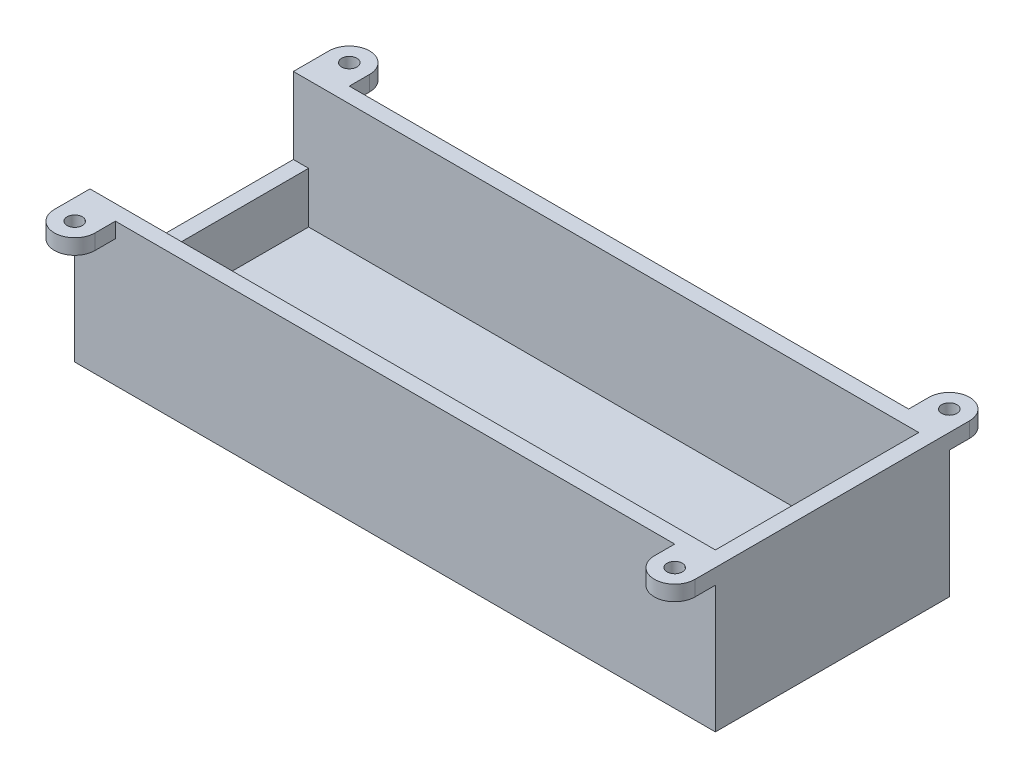
ISO-10303-21;
HEADER;
FILE_DESCRIPTION(('STEP AP214'),'2;1');
FILE_NAME('part.step','',(''),(''),'','','');
FILE_SCHEMA(('AUTOMOTIVE_DESIGN { 1 0 10303 214 1 1 1 1 }'));
ENDSEC;
DATA;
#1=APPLICATION_CONTEXT('core data for automotive mechanical design processes');
#2=APPLICATION_PROTOCOL_DEFINITION('international standard','automotive_design',2000,#1);
#3=PRODUCT_CONTEXT('',#1,'mechanical');
#4=PRODUCT('Part','Part','',(#3));
#5=PRODUCT_RELATED_PRODUCT_CATEGORY('part','',(#4));
#6=PRODUCT_DEFINITION_FORMATION('','',#4);
#7=PRODUCT_DEFINITION_CONTEXT('part definition',#1,'design');
#8=PRODUCT_DEFINITION('design','',#6,#7);
#9=PRODUCT_DEFINITION_SHAPE('','',#8);
#10=(LENGTH_UNIT() NAMED_UNIT(*) SI_UNIT(.MILLI.,.METRE.));
#11=(NAMED_UNIT(*) PLANE_ANGLE_UNIT() SI_UNIT($,.RADIAN.));
#12=(NAMED_UNIT(*) SI_UNIT($,.STERADIAN.) SOLID_ANGLE_UNIT());
#13=UNCERTAINTY_MEASURE_WITH_UNIT(LENGTH_MEASURE(1.E-05),#10,'distance_accuracy_value','');
#14=(GEOMETRIC_REPRESENTATION_CONTEXT(3) GLOBAL_UNCERTAINTY_ASSIGNED_CONTEXT((#13)) GLOBAL_UNIT_ASSIGNED_CONTEXT((#10,
#11,#12)) REPRESENTATION_CONTEXT('',''));
#15=CARTESIAN_POINT('',(0.,0.,0.));
#16=DIRECTION('',(0.,0.,1.));
#17=DIRECTION('',(1.,0.,0.));
#18=AXIS2_PLACEMENT_3D('',#15,#16,#17);
#19=CARTESIAN_POINT('',(-63.,3.,23.));
#20=DIRECTION('',(0.,0.,-1.));
#21=DIRECTION('',(-1.,0.,0.));
#22=AXIS2_PLACEMENT_3D('',#19,#20,#21);
#23=PLANE('',#22);
#24=DIRECTION('',(-1.,0.,0.));
#25=VECTOR('',#24,1.);
#26=CARTESIAN_POINT('',(55.,25.,23.));
#27=LINE('',#26,#25);
#28=CARTESIAN_POINT('',(63.,25.,23.));
#29=VERTEX_POINT('',#28);
#30=CARTESIAN_POINT('',(55.,25.,23.));
#31=VERTEX_POINT('',#30);
#32=EDGE_CURVE('E370',#29,#31,#27,.T.);
#33=ORIENTED_EDGE('',*,*,#32,.T.);
#34=DIRECTION('',(0.,1.,0.));
#35=VECTOR('',#34,1.);
#36=CARTESIAN_POINT('',(55.,25.,23.));
#37=LINE('',#36,#35);
#38=CARTESIAN_POINT('',(55.,28.,23.));
#39=VERTEX_POINT('',#38);
#40=EDGE_CURVE('E382',#31,#39,#37,.T.);
#41=ORIENTED_EDGE('',*,*,#40,.T.);
#42=DIRECTION('',(1.,0.,0.));
#43=VECTOR('',#42,1.);
#44=CARTESIAN_POINT('',(-63.,28.,23.));
#45=LINE('',#44,#43);
#46=CARTESIAN_POINT('',(-55.,28.,23.));
#47=VERTEX_POINT('',#46);
#48=EDGE_CURVE('E300',#47,#39,#45,.T.);
#49=ORIENTED_EDGE('',*,*,#48,.F.);
#50=DIRECTION('',(0.,1.,0.));
#51=VECTOR('',#50,1.);
#52=CARTESIAN_POINT('',(-55.,25.,23.));
#53=LINE('',#52,#51);
#54=CARTESIAN_POINT('',(-55.,25.,23.));
#55=VERTEX_POINT('',#54);
#56=EDGE_CURVE('E263',#55,#47,#53,.T.);
#57=ORIENTED_EDGE('',*,*,#56,.F.);
#58=DIRECTION('',(-1.,0.,0.));
#59=VECTOR('',#58,1.);
#60=CARTESIAN_POINT('',(-63.,25.,23.));
#61=LINE('',#60,#59);
#62=CARTESIAN_POINT('',(-63.,25.,23.));
#63=VERTEX_POINT('',#62);
#64=EDGE_CURVE('E253',#55,#63,#61,.T.);
#65=ORIENTED_EDGE('',*,*,#64,.T.);
#66=DIRECTION('',(0.,-1.,0.));
#67=VECTOR('',#66,1.);
#68=CARTESIAN_POINT('',(-63.,3.,23.));
#69=LINE('',#68,#67);
#70=CARTESIAN_POINT('',(-63.,0.,23.));
#71=VERTEX_POINT('',#70);
#72=EDGE_CURVE('E231',#63,#71,#69,.T.);
#73=ORIENTED_EDGE('',*,*,#72,.T.);
#74=DIRECTION('',(1.,0.,0.));
#75=VECTOR('',#74,1.);
#76=CARTESIAN_POINT('',(-63.,0.,23.));
#77=LINE('',#76,#75);
#78=CARTESIAN_POINT('',(63.,0.,23.));
#79=VERTEX_POINT('',#78);
#80=EDGE_CURVE('E226',#71,#79,#77,.T.);
#81=ORIENTED_EDGE('',*,*,#80,.T.);
#82=DIRECTION('',(0.,-1.,0.));
#83=VECTOR('',#82,1.);
#84=CARTESIAN_POINT('',(63.,3.,23.));
#85=LINE('',#84,#83);
#86=EDGE_CURVE('E229',#29,#79,#85,.T.);
#87=ORIENTED_EDGE('',*,*,#86,.F.);
#88=EDGE_LOOP('',(#33,#41,#49,#57,#65,#73,#81,#87));
#89=FACE_BOUND('',#88,.T.);
#90=ADVANCED_FACE('F35',(#89),#23,.F.);
#91=CARTESIAN_POINT('',(63.,3.,-23.));
#92=DIRECTION('',(-1.,0.,0.));
#93=DIRECTION('',(0.,0.,1.));
#94=AXIS2_PLACEMENT_3D('',#91,#92,#93);
#95=PLANE('',#94);
#96=DIRECTION('',(0.,0.,-1.));
#97=VECTOR('',#96,1.);
#98=CARTESIAN_POINT('',(63.,0.,-23.));
#99=LINE('',#98,#97);
#100=CARTESIAN_POINT('',(63.,0.,-23.));
#101=VERTEX_POINT('',#100);
#102=EDGE_CURVE('E212',#79,#101,#99,.T.);
#103=ORIENTED_EDGE('',*,*,#102,.T.);
#104=DIRECTION('',(0.,-1.,0.));
#105=VECTOR('',#104,1.);
#106=CARTESIAN_POINT('',(63.,3.,-23.));
#107=LINE('',#106,#105);
#108=CARTESIAN_POINT('',(63.,25.,-23.));
#109=VERTEX_POINT('',#108);
#110=EDGE_CURVE('E11',#109,#101,#107,.T.);
#111=ORIENTED_EDGE('',*,*,#110,.F.);
#112=DIRECTION('',(0.,0.,-1.));
#113=VECTOR('',#112,1.);
#114=CARTESIAN_POINT('',(63.,25.,-23.));
#115=LINE('',#114,#113);
#116=CARTESIAN_POINT('',(63.,25.,-27.));
#117=VERTEX_POINT('',#116);
#118=EDGE_CURVE('E316',#109,#117,#115,.T.);
#119=ORIENTED_EDGE('',*,*,#118,.T.);
#120=DIRECTION('',(0.,1.,0.));
#121=VECTOR('',#120,1.);
#122=CARTESIAN_POINT('',(63.,25.,-27.));
#123=LINE('',#122,#121);
#124=CARTESIAN_POINT('',(63.,28.,-27.));
#125=VERTEX_POINT('',#124);
#126=EDGE_CURVE('E315',#117,#125,#123,.T.);
#127=ORIENTED_EDGE('',*,*,#126,.T.);
#128=DIRECTION('',(0.,0.,-1.));
#129=VECTOR('',#128,1.);
#130=CARTESIAN_POINT('',(63.,28.,23.));
#131=LINE('',#130,#129);
#132=CARTESIAN_POINT('',(63.,28.,27.));
#133=VERTEX_POINT('',#132);
#134=EDGE_CURVE('E302',#133,#125,#131,.T.);
#135=ORIENTED_EDGE('',*,*,#134,.F.);
#136=DIRECTION('',(0.,1.,0.));
#137=VECTOR('',#136,1.);
#138=CARTESIAN_POINT('',(63.,25.,27.));
#139=LINE('',#138,#137);
#140=CARTESIAN_POINT('',(63.,25.,27.));
#141=VERTEX_POINT('',#140);
#142=EDGE_CURVE('E375',#141,#133,#139,.T.);
#143=ORIENTED_EDGE('',*,*,#142,.F.);
#144=DIRECTION('',(0.,0.,-1.));
#145=VECTOR('',#144,1.);
#146=CARTESIAN_POINT('',(63.,25.,23.));
#147=LINE('',#146,#145);
#148=EDGE_CURVE('E366',#141,#29,#147,.T.);
#149=ORIENTED_EDGE('',*,*,#148,.T.);
#150=ORIENTED_EDGE('',*,*,#86,.T.);
#151=EDGE_LOOP('',(#103,#111,#119,#127,#135,#143,#149,#150));
#152=FACE_BOUND('',#151,.T.);
#153=ADVANCED_FACE('F37',(#152),#95,.F.);
#154=CARTESIAN_POINT('',(-63.,3.,-23.));
#155=DIRECTION('',(0.,0.,1.));
#156=DIRECTION('',(1.,0.,0.));
#157=AXIS2_PLACEMENT_3D('',#154,#155,#156);
#158=PLANE('',#157);
#159=DIRECTION('',(-1.,0.,0.));
#160=VECTOR('',#159,1.);
#161=CARTESIAN_POINT('',(63.,28.,-23.));
#162=LINE('',#161,#160);
#163=CARTESIAN_POINT('',(55.,28.,-23.));
#164=VERTEX_POINT('',#163);
#165=CARTESIAN_POINT('',(-55.,28.,-23.));
#166=VERTEX_POINT('',#165);
#167=EDGE_CURVE('E55',#164,#166,#162,.T.);
#168=ORIENTED_EDGE('',*,*,#167,.F.);
#169=DIRECTION('',(0.,1.,0.));
#170=VECTOR('',#169,1.);
#171=CARTESIAN_POINT('',(55.,25.,-23.));
#172=LINE('',#171,#170);
#173=CARTESIAN_POINT('',(55.,25.,-23.));
#174=VERTEX_POINT('',#173);
#175=EDGE_CURVE('E320',#174,#164,#172,.T.);
#176=ORIENTED_EDGE('',*,*,#175,.F.);
#177=DIRECTION('',(1.,0.,0.));
#178=VECTOR('',#177,1.);
#179=CARTESIAN_POINT('',(55.,25.,-23.));
#180=LINE('',#179,#178);
#181=EDGE_CURVE('E729',#174,#109,#180,.T.);
#182=ORIENTED_EDGE('',*,*,#181,.T.);
#183=ORIENTED_EDGE('',*,*,#110,.T.);
#184=DIRECTION('',(-1.,0.,0.));
#185=VECTOR('',#184,1.);
#186=CARTESIAN_POINT('',(-63.,0.,-23.));
#187=LINE('',#186,#185);
#188=CARTESIAN_POINT('',(-63.,0.,-23.));
#189=VERTEX_POINT('',#188);
#190=EDGE_CURVE('E216',#101,#189,#187,.T.);
#191=ORIENTED_EDGE('',*,*,#190,.T.);
#192=DIRECTION('',(0.,-1.,0.));
#193=VECTOR('',#192,1.);
#194=CARTESIAN_POINT('',(-63.,3.,-23.));
#195=LINE('',#194,#193);
#196=CARTESIAN_POINT('',(-63.,25.,-23.));
#197=VERTEX_POINT('',#196);
#198=EDGE_CURVE('E43',#197,#189,#195,.T.);
#199=ORIENTED_EDGE('',*,*,#198,.F.);
#200=DIRECTION('',(1.,0.,0.));
#201=VECTOR('',#200,1.);
#202=CARTESIAN_POINT('',(-63.,25.,-23.));
#203=LINE('',#202,#201);
#204=CARTESIAN_POINT('',(-55.,25.,-23.));
#205=VERTEX_POINT('',#204);
#206=EDGE_CURVE('E343',#197,#205,#203,.T.);
#207=ORIENTED_EDGE('',*,*,#206,.T.);
#208=DIRECTION('',(0.,1.,0.));
#209=VECTOR('',#208,1.);
#210=CARTESIAN_POINT('',(-55.,25.,-23.));
#211=LINE('',#210,#209);
#212=EDGE_CURVE('E355',#205,#166,#211,.T.);
#213=ORIENTED_EDGE('',*,*,#212,.T.);
#214=EDGE_LOOP('',(#168,#176,#182,#183,#191,#199,#207,#213));
#215=FACE_BOUND('',#214,.T.);
#216=ADVANCED_FACE('F242',(#215),#158,.F.);
#217=CARTESIAN_POINT('',(-63.,3.,-23.));
#218=DIRECTION('',(1.,0.,0.));
#219=DIRECTION('',(0.,0.,-1.));
#220=AXIS2_PLACEMENT_3D('',#217,#218,#219);
#221=PLANE('',#220);
#222=DIRECTION('',(0.,0.,-1.));
#223=VECTOR('',#222,1.);
#224=CARTESIAN_POINT('',(-63.,13.,-20.));
#225=LINE('',#224,#223);
#226=CARTESIAN_POINT('',(-63.,13.,20.));
#227=VERTEX_POINT('',#226);
#228=CARTESIAN_POINT('',(-63.,13.,-20.));
#229=VERTEX_POINT('',#228);
#230=EDGE_CURVE('E204',#227,#229,#225,.T.);
#231=ORIENTED_EDGE('',*,*,#230,.T.);
#232=DIRECTION('',(0.,1.,0.));
#233=VECTOR('',#232,1.);
#234=CARTESIAN_POINT('',(-63.,28.,-20.));
#235=LINE('',#234,#233);
#236=CARTESIAN_POINT('',(-63.,28.,-20.));
#237=VERTEX_POINT('',#236);
#238=EDGE_CURVE('E188',#229,#237,#235,.T.);
#239=ORIENTED_EDGE('',*,*,#238,.T.);
#240=DIRECTION('',(0.,0.,1.));
#241=VECTOR('',#240,1.);
#242=CARTESIAN_POINT('',(-63.,28.,-23.));
#243=LINE('',#242,#241);
#244=CARTESIAN_POINT('',(-63.,28.,-27.));
#245=VERTEX_POINT('',#244);
#246=EDGE_CURVE('E200',#245,#237,#243,.T.);
#247=ORIENTED_EDGE('',*,*,#246,.F.);
#248=DIRECTION('',(0.,1.,0.));
#249=VECTOR('',#248,1.);
#250=CARTESIAN_POINT('',(-63.,25.,-27.));
#251=LINE('',#250,#249);
#252=CARTESIAN_POINT('',(-63.,25.,-27.));
#253=VERTEX_POINT('',#252);
#254=EDGE_CURVE('E348',#253,#245,#251,.T.);
#255=ORIENTED_EDGE('',*,*,#254,.F.);
#256=DIRECTION('',(0.,0.,1.));
#257=VECTOR('',#256,1.);
#258=CARTESIAN_POINT('',(-63.,25.,-27.));
#259=LINE('',#258,#257);
#260=EDGE_CURVE('E238',#253,#197,#259,.T.);
#261=ORIENTED_EDGE('',*,*,#260,.T.);
#262=ORIENTED_EDGE('',*,*,#198,.T.);
#263=DIRECTION('',(0.,0.,1.));
#264=VECTOR('',#263,1.);
#265=CARTESIAN_POINT('',(-63.,0.,-23.));
#266=LINE('',#265,#264);
#267=EDGE_CURVE('E223',#189,#71,#266,.T.);
#268=ORIENTED_EDGE('',*,*,#267,.T.);
#269=ORIENTED_EDGE('',*,*,#72,.F.);
#270=DIRECTION('',(0.,0.,1.));
#271=VECTOR('',#270,1.);
#272=CARTESIAN_POINT('',(-63.,25.,27.));
#273=LINE('',#272,#271);
#274=CARTESIAN_POINT('',(-63.,25.,27.));
#275=VERTEX_POINT('',#274);
#276=EDGE_CURVE('E256',#63,#275,#273,.T.);
#277=ORIENTED_EDGE('',*,*,#276,.T.);
#278=DIRECTION('',(0.,1.,0.));
#279=VECTOR('',#278,1.);
#280=CARTESIAN_POINT('',(-63.,25.,27.));
#281=LINE('',#280,#279);
#282=CARTESIAN_POINT('',(-63.,28.,27.));
#283=VERTEX_POINT('',#282);
#284=EDGE_CURVE('E258',#275,#283,#281,.T.);
#285=ORIENTED_EDGE('',*,*,#284,.T.);
#286=CARTESIAN_POINT('',(-63.,28.,20.));
#287=VERTEX_POINT('',#286);
#288=EDGE_CURVE('E213',#287,#283,#243,.T.);
#289=ORIENTED_EDGE('',*,*,#288,.F.);
#290=DIRECTION('',(0.,-1.,0.));
#291=VECTOR('',#290,1.);
#292=CARTESIAN_POINT('',(-63.,28.,20.));
#293=LINE('',#292,#291);
#294=EDGE_CURVE('E205',#287,#227,#293,.T.);
#295=ORIENTED_EDGE('',*,*,#294,.T.);
#296=EDGE_LOOP('',(#231,#239,#247,#255,#261,#262,#268,#269,#277,#285,#289,#295));
#297=FACE_BOUND('',#296,.T.);
#298=ADVANCED_FACE('F198',(#297),#221,.F.);
#299=CARTESIAN_POINT('',(0.,0.,0.));
#300=DIRECTION('',(0.,1.,0.));
#301=DIRECTION('',(0.,0.,1.));
#302=AXIS2_PLACEMENT_3D('',#299,#300,#301);
#303=PLANE('',#302);
#304=ORIENTED_EDGE('',*,*,#102,.F.);
#305=ORIENTED_EDGE('',*,*,#80,.F.);
#306=ORIENTED_EDGE('',*,*,#267,.F.);
#307=ORIENTED_EDGE('',*,*,#190,.F.);
#308=EDGE_LOOP('',(#304,#305,#306,#307));
#309=FACE_BOUND('',#308,.T.);
#310=ADVANCED_FACE('F247',(#309),#303,.F.);
#311=CARTESIAN_POINT('',(0.,28.,0.));
#312=DIRECTION('',(0.,1.,0.));
#313=DIRECTION('',(0.,0.,1.));
#314=AXIS2_PLACEMENT_3D('',#311,#312,#313);
#315=PLANE('',#314);
#316=ORIENTED_EDGE('',*,*,#246,.T.);
#317=DIRECTION('',(-1.,0.,0.));
#318=VECTOR('',#317,1.);
#319=CARTESIAN_POINT('',(60.,28.,-20.));
#320=LINE('',#319,#318);
#321=CARTESIAN_POINT('',(60.,28.,-20.));
#322=VERTEX_POINT('',#321);
#323=EDGE_CURVE('E184',#322,#237,#320,.T.);
#324=ORIENTED_EDGE('',*,*,#323,.F.);
#325=DIRECTION('',(0.,0.,-1.));
#326=VECTOR('',#325,1.);
#327=CARTESIAN_POINT('',(60.,28.,20.));
#328=LINE('',#327,#326);
#329=CARTESIAN_POINT('',(60.,28.,20.));
#330=VERTEX_POINT('',#329);
#331=EDGE_CURVE('E282',#330,#322,#328,.T.);
#332=ORIENTED_EDGE('',*,*,#331,.F.);
#333=DIRECTION('',(1.,0.,0.));
#334=VECTOR('',#333,1.);
#335=CARTESIAN_POINT('',(-60.,28.,20.));
#336=LINE('',#335,#334);
#337=EDGE_CURVE('E194',#287,#330,#336,.T.);
#338=ORIENTED_EDGE('',*,*,#337,.F.);
#339=ORIENTED_EDGE('',*,*,#288,.T.);
#340=CARTESIAN_POINT('',(-59.,28.,27.));
#341=DIRECTION('',(0.,1.,0.));
#342=DIRECTION('',(0.,0.,1.));
#343=AXIS2_PLACEMENT_3D('',#340,#341,#342);
#344=CIRCLE('',#343,4.);
#345=CARTESIAN_POINT('',(-55.,28.,27.));
#346=VERTEX_POINT('',#345);
#347=EDGE_CURVE('E269',#283,#346,#344,.T.);
#348=ORIENTED_EDGE('',*,*,#347,.T.);
#349=DIRECTION('',(0.,0.,-1.));
#350=VECTOR('',#349,1.);
#351=CARTESIAN_POINT('',(-55.,28.,27.));
#352=LINE('',#351,#350);
#353=EDGE_CURVE('E272',#346,#47,#352,.T.);
#354=ORIENTED_EDGE('',*,*,#353,.T.);
#355=ORIENTED_EDGE('',*,*,#48,.T.);
#356=DIRECTION('',(0.,0.,1.));
#357=VECTOR('',#356,1.);
#358=CARTESIAN_POINT('',(55.,28.,27.));
#359=LINE('',#358,#357);
#360=CARTESIAN_POINT('',(55.,28.,27.));
#361=VERTEX_POINT('',#360);
#362=EDGE_CURVE('E367',#39,#361,#359,.T.);
#363=ORIENTED_EDGE('',*,*,#362,.T.);
#364=CARTESIAN_POINT('',(59.,28.,27.));
#365=DIRECTION('',(0.,1.,0.));
#366=DIRECTION('',(0.,0.,1.));
#367=AXIS2_PLACEMENT_3D('',#364,#365,#366);
#368=CIRCLE('',#367,4.);
#369=EDGE_CURVE('E309',#361,#133,#368,.T.);
#370=ORIENTED_EDGE('',*,*,#369,.T.);
#371=ORIENTED_EDGE('',*,*,#134,.T.);
#372=CARTESIAN_POINT('',(59.,28.,-27.));
#373=DIRECTION('',(0.,1.,0.));
#374=DIRECTION('',(0.,0.,-1.));
#375=AXIS2_PLACEMENT_3D('',#372,#373,#374);
#376=CIRCLE('',#375,4.);
#377=CARTESIAN_POINT('',(55.,28.,-27.));
#378=VERTEX_POINT('',#377);
#379=EDGE_CURVE('E306',#125,#378,#376,.T.);
#380=ORIENTED_EDGE('',*,*,#379,.T.);
#381=DIRECTION('',(0.,0.,1.));
#382=VECTOR('',#381,1.);
#383=CARTESIAN_POINT('',(55.,28.,-27.));
#384=LINE('',#383,#382);
#385=EDGE_CURVE('E50',#378,#164,#384,.T.);
#386=ORIENTED_EDGE('',*,*,#385,.T.);
#387=ORIENTED_EDGE('',*,*,#167,.T.);
#388=DIRECTION('',(0.,0.,-1.));
#389=VECTOR('',#388,1.);
#390=CARTESIAN_POINT('',(-55.,28.,-27.));
#391=LINE('',#390,#389);
#392=CARTESIAN_POINT('',(-55.,28.,-27.));
#393=VERTEX_POINT('',#392);
#394=EDGE_CURVE('E341',#166,#393,#391,.T.);
#395=ORIENTED_EDGE('',*,*,#394,.T.);
#396=CARTESIAN_POINT('',(-59.,28.,-27.));
#397=DIRECTION('',(0.,1.,0.));
#398=DIRECTION('',(0.,0.,-1.));
#399=AXIS2_PLACEMENT_3D('',#396,#397,#398);
#400=CIRCLE('',#399,4.);
#401=EDGE_CURVE('E211',#393,#245,#400,.T.);
#402=ORIENTED_EDGE('',*,*,#401,.T.);
#403=EDGE_LOOP('',(#316,#324,#332,#338,#339,#348,#354,#355,#363,#370,#371,#380,#386,#387,#395,#402));
#404=FACE_BOUND('',#403,.T.);
#405=CARTESIAN_POINT('',(-59.,28.,27.));
#406=DIRECTION('',(0.,1.,0.));
#407=DIRECTION('',(0.,0.,1.));
#408=AXIS2_PLACEMENT_3D('',#405,#406,#407);
#409=CIRCLE('',#408,1.5);
#410=CARTESIAN_POINT('',(-59.,28.,28.5));
#411=VERTEX_POINT('',#410);
#412=EDGE_CURVE('E381',#411,#411,#409,.T.);
#413=ORIENTED_EDGE('',*,*,#412,.F.);
#414=EDGE_LOOP('',(#413));
#415=FACE_BOUND('',#414,.T.);
#416=CARTESIAN_POINT('',(59.,28.,27.));
#417=DIRECTION('',(0.,1.,0.));
#418=DIRECTION('',(0.,0.,1.));
#419=AXIS2_PLACEMENT_3D('',#416,#417,#418);
#420=CIRCLE('',#419,1.5);
#421=CARTESIAN_POINT('',(59.,28.,28.5));
#422=VERTEX_POINT('',#421);
#423=EDGE_CURVE('E354',#422,#422,#420,.T.);
#424=ORIENTED_EDGE('',*,*,#423,.F.);
#425=EDGE_LOOP('',(#424));
#426=FACE_BOUND('',#425,.T.);
#427=CARTESIAN_POINT('',(-59.,28.,-27.));
#428=DIRECTION('',(0.,1.,0.));
#429=DIRECTION('',(0.,0.,-1.));
#430=AXIS2_PLACEMENT_3D('',#427,#428,#429);
#431=CIRCLE('',#430,1.5);
#432=CARTESIAN_POINT('',(-59.,28.,-28.5));
#433=VERTEX_POINT('',#432);
#434=EDGE_CURVE('E319',#433,#433,#431,.T.);
#435=ORIENTED_EDGE('',*,*,#434,.F.);
#436=EDGE_LOOP('',(#435));
#437=FACE_BOUND('',#436,.T.);
#438=CARTESIAN_POINT('',(59.,28.,-27.));
#439=DIRECTION('',(0.,1.,0.));
#440=DIRECTION('',(0.,0.,-1.));
#441=AXIS2_PLACEMENT_3D('',#438,#439,#440);
#442=CIRCLE('',#441,1.5);
#443=CARTESIAN_POINT('',(59.,28.,-28.5));
#444=VERTEX_POINT('',#443);
#445=EDGE_CURVE('E721',#444,#444,#442,.T.);
#446=ORIENTED_EDGE('',*,*,#445,.F.);
#447=EDGE_LOOP('',(#446));
#448=FACE_BOUND('',#447,.T.);
#449=ADVANCED_FACE('F209',(#404,#415,#426,#437,#448),#315,.T.);
#450=CARTESIAN_POINT('',(60.,28.,-20.));
#451=DIRECTION('',(0.,0.,1.));
#452=DIRECTION('',(1.,0.,0.));
#453=AXIS2_PLACEMENT_3D('',#450,#451,#452);
#454=PLANE('',#453);
#455=DIRECTION('',(-1.,0.,0.));
#456=VECTOR('',#455,1.);
#457=CARTESIAN_POINT('',(60.,3.,-20.));
#458=LINE('',#457,#456);
#459=CARTESIAN_POINT('',(60.,3.,-20.));
#460=VERTEX_POINT('',#459);
#461=CARTESIAN_POINT('',(-60.,3.,-20.));
#462=VERTEX_POINT('',#461);
#463=EDGE_CURVE('E278',#460,#462,#458,.T.);
#464=ORIENTED_EDGE('',*,*,#463,.F.);
#465=DIRECTION('',(0.,-1.,0.));
#466=VECTOR('',#465,1.);
#467=CARTESIAN_POINT('',(60.,28.,-20.));
#468=LINE('',#467,#466);
#469=EDGE_CURVE('E191',#322,#460,#468,.T.);
#470=ORIENTED_EDGE('',*,*,#469,.F.);
#471=ORIENTED_EDGE('',*,*,#323,.T.);
#472=ORIENTED_EDGE('',*,*,#238,.F.);
#473=DIRECTION('',(1.,0.,0.));
#474=VECTOR('',#473,1.);
#475=CARTESIAN_POINT('',(-63.,13.,-20.));
#476=LINE('',#475,#474);
#477=CARTESIAN_POINT('',(-60.,13.,-20.));
#478=VERTEX_POINT('',#477);
#479=EDGE_CURVE('E709',#229,#478,#476,.T.);
#480=ORIENTED_EDGE('',*,*,#479,.T.);
#481=DIRECTION('',(0.,-1.,0.));
#482=VECTOR('',#481,1.);
#483=CARTESIAN_POINT('',(-60.,28.,-20.));
#484=LINE('',#483,#482);
#485=EDGE_CURVE('E298',#478,#462,#484,.T.);
#486=ORIENTED_EDGE('',*,*,#485,.T.);
#487=EDGE_LOOP('',(#464,#470,#471,#472,#480,#486));
#488=FACE_BOUND('',#487,.T.);
#489=ADVANCED_FACE('F187',(#488),#454,.T.);
#490=CARTESIAN_POINT('',(-60.,28.,-20.));
#491=DIRECTION('',(1.,0.,0.));
#492=DIRECTION('',(0.,0.,-1.));
#493=AXIS2_PLACEMENT_3D('',#490,#491,#492);
#494=PLANE('',#493);
#495=DIRECTION('',(0.,0.,-1.));
#496=VECTOR('',#495,1.);
#497=CARTESIAN_POINT('',(-60.,13.,-20.));
#498=LINE('',#497,#496);
#499=CARTESIAN_POINT('',(-60.,13.,20.));
#500=VERTEX_POINT('',#499);
#501=EDGE_CURVE('E206',#500,#478,#498,.T.);
#502=ORIENTED_EDGE('',*,*,#501,.F.);
#503=DIRECTION('',(0.,-1.,0.));
#504=VECTOR('',#503,1.);
#505=CARTESIAN_POINT('',(-60.,28.,20.));
#506=LINE('',#505,#504);
#507=CARTESIAN_POINT('',(-60.,3.,20.));
#508=VERTEX_POINT('',#507);
#509=EDGE_CURVE('E296',#500,#508,#506,.T.);
#510=ORIENTED_EDGE('',*,*,#509,.T.);
#511=DIRECTION('',(0.,0.,1.));
#512=VECTOR('',#511,1.);
#513=CARTESIAN_POINT('',(-60.,3.,-20.));
#514=LINE('',#513,#512);
#515=EDGE_CURVE('E286',#462,#508,#514,.T.);
#516=ORIENTED_EDGE('',*,*,#515,.F.);
#517=ORIENTED_EDGE('',*,*,#485,.F.);
#518=EDGE_LOOP('',(#502,#510,#516,#517));
#519=FACE_BOUND('',#518,.T.);
#520=ADVANCED_FACE('F452',(#519),#494,.T.);
#521=CARTESIAN_POINT('',(-60.,28.,20.));
#522=DIRECTION('',(0.,0.,-1.));
#523=DIRECTION('',(-1.,0.,0.));
#524=AXIS2_PLACEMENT_3D('',#521,#522,#523);
#525=PLANE('',#524);
#526=DIRECTION('',(1.,0.,0.));
#527=VECTOR('',#526,1.);
#528=CARTESIAN_POINT('',(-60.,3.,20.));
#529=LINE('',#528,#527);
#530=CARTESIAN_POINT('',(60.,3.,20.));
#531=VERTEX_POINT('',#530);
#532=EDGE_CURVE('E289',#508,#531,#529,.T.);
#533=ORIENTED_EDGE('',*,*,#532,.F.);
#534=ORIENTED_EDGE('',*,*,#509,.F.);
#535=DIRECTION('',(1.,0.,0.));
#536=VECTOR('',#535,1.);
#537=CARTESIAN_POINT('',(-63.,13.,20.));
#538=LINE('',#537,#536);
#539=EDGE_CURVE('E710',#227,#500,#538,.T.);
#540=ORIENTED_EDGE('',*,*,#539,.F.);
#541=ORIENTED_EDGE('',*,*,#294,.F.);
#542=ORIENTED_EDGE('',*,*,#337,.T.);
#543=DIRECTION('',(0.,-1.,0.));
#544=VECTOR('',#543,1.);
#545=CARTESIAN_POINT('',(60.,28.,20.));
#546=LINE('',#545,#544);
#547=EDGE_CURVE('E293',#330,#531,#546,.T.);
#548=ORIENTED_EDGE('',*,*,#547,.T.);
#549=EDGE_LOOP('',(#533,#534,#540,#541,#542,#548));
#550=FACE_BOUND('',#549,.T.);
#551=ADVANCED_FACE('F459',(#550),#525,.T.);
#552=CARTESIAN_POINT('',(60.,28.,20.));
#553=DIRECTION('',(-1.,0.,0.));
#554=DIRECTION('',(0.,0.,1.));
#555=AXIS2_PLACEMENT_3D('',#552,#553,#554);
#556=PLANE('',#555);
#557=DIRECTION('',(0.,0.,-1.));
#558=VECTOR('',#557,1.);
#559=CARTESIAN_POINT('',(60.,3.,20.));
#560=LINE('',#559,#558);
#561=EDGE_CURVE('E195',#531,#460,#560,.T.);
#562=ORIENTED_EDGE('',*,*,#561,.F.);
#563=ORIENTED_EDGE('',*,*,#547,.F.);
#564=ORIENTED_EDGE('',*,*,#331,.T.);
#565=ORIENTED_EDGE('',*,*,#469,.T.);
#566=EDGE_LOOP('',(#562,#563,#564,#565));
#567=FACE_BOUND('',#566,.T.);
#568=ADVANCED_FACE('F467',(#567),#556,.T.);
#569=CARTESIAN_POINT('',(0.,3.,0.));
#570=DIRECTION('',(0.,1.,0.));
#571=DIRECTION('',(0.,0.,1.));
#572=AXIS2_PLACEMENT_3D('',#569,#570,#571);
#573=PLANE('',#572);
#574=ORIENTED_EDGE('',*,*,#463,.T.);
#575=ORIENTED_EDGE('',*,*,#515,.T.);
#576=ORIENTED_EDGE('',*,*,#532,.T.);
#577=ORIENTED_EDGE('',*,*,#561,.T.);
#578=EDGE_LOOP('',(#574,#575,#576,#577));
#579=FACE_BOUND('',#578,.T.);
#580=ADVANCED_FACE('F475',(#579),#573,.T.);
#581=CARTESIAN_POINT('',(-55.,25.,27.));
#582=DIRECTION('',(1.,0.,0.));
#583=DIRECTION('',(0.,0.,-1.));
#584=AXIS2_PLACEMENT_3D('',#581,#582,#583);
#585=PLANE('',#584);
#586=ORIENTED_EDGE('',*,*,#353,.F.);
#587=DIRECTION('',(0.,1.,0.));
#588=VECTOR('',#587,1.);
#589=CARTESIAN_POINT('',(-55.,25.,27.));
#590=LINE('',#589,#588);
#591=CARTESIAN_POINT('',(-55.,25.,27.));
#592=VERTEX_POINT('',#591);
#593=EDGE_CURVE('E261',#592,#346,#590,.T.);
#594=ORIENTED_EDGE('',*,*,#593,.F.);
#595=DIRECTION('',(0.,0.,-1.));
#596=VECTOR('',#595,1.);
#597=CARTESIAN_POINT('',(-55.,25.,27.));
#598=LINE('',#597,#596);
#599=EDGE_CURVE('E265',#592,#55,#598,.T.);
#600=ORIENTED_EDGE('',*,*,#599,.T.);
#601=ORIENTED_EDGE('',*,*,#56,.T.);
#602=EDGE_LOOP('',(#586,#594,#600,#601));
#603=FACE_BOUND('',#602,.T.);
#604=ADVANCED_FACE('F395',(#603),#585,.T.);
#605=CARTESIAN_POINT('',(-59.,25.,27.));
#606=DIRECTION('',(0.,1.,0.));
#607=DIRECTION('',(0.,0.,1.));
#608=AXIS2_PLACEMENT_3D('',#605,#606,#607);
#609=CYLINDRICAL_SURFACE('',#608,4.);
#610=ORIENTED_EDGE('',*,*,#347,.F.);
#611=ORIENTED_EDGE('',*,*,#284,.F.);
#612=CARTESIAN_POINT('',(-59.,25.,27.));
#613=DIRECTION('',(0.,1.,0.));
#614=DIRECTION('',(0.,0.,1.));
#615=AXIS2_PLACEMENT_3D('',#612,#613,#614);
#616=CIRCLE('',#615,4.);
#617=EDGE_CURVE('E276',#275,#592,#616,.T.);
#618=ORIENTED_EDGE('',*,*,#617,.T.);
#619=ORIENTED_EDGE('',*,*,#593,.T.);
#620=EDGE_LOOP('',(#610,#611,#618,#619));
#621=FACE_BOUND('',#620,.T.);
#622=ADVANCED_FACE('F399',(#621),#609,.T.);
#623=CARTESIAN_POINT('',(-59.,25.,27.));
#624=DIRECTION('',(0.,1.,0.));
#625=DIRECTION('',(0.,0.,1.));
#626=AXIS2_PLACEMENT_3D('',#623,#624,#625);
#627=PLANE('',#626);
#628=CARTESIAN_POINT('',(-59.,25.,27.));
#629=DIRECTION('',(0.,1.,0.));
#630=DIRECTION('',(0.,0.,1.));
#631=AXIS2_PLACEMENT_3D('',#628,#629,#630);
#632=CIRCLE('',#631,1.5);
#633=CARTESIAN_POINT('',(-59.,25.,28.5));
#634=VERTEX_POINT('',#633);
#635=EDGE_CURVE('E273',#634,#634,#632,.T.);
#636=ORIENTED_EDGE('',*,*,#635,.T.);
#637=EDGE_LOOP('',(#636));
#638=FACE_BOUND('',#637,.T.);
#639=ORIENTED_EDGE('',*,*,#617,.F.);
#640=ORIENTED_EDGE('',*,*,#276,.F.);
#641=ORIENTED_EDGE('',*,*,#64,.F.);
#642=ORIENTED_EDGE('',*,*,#599,.F.);
#643=EDGE_LOOP('',(#639,#640,#641,#642));
#644=FACE_BOUND('',#643,.T.);
#645=ADVANCED_FACE('F400',(#638,#644),#627,.F.);
#646=CARTESIAN_POINT('',(-59.,25.,27.));
#647=DIRECTION('',(0.,1.,0.));
#648=DIRECTION('',(0.,0.,1.));
#649=AXIS2_PLACEMENT_3D('',#646,#647,#648);
#650=CYLINDRICAL_SURFACE('',#649,1.5);
#651=ORIENTED_EDGE('',*,*,#635,.F.);
#652=EDGE_LOOP('',(#651));
#653=FACE_BOUND('',#652,.T.);
#654=ORIENTED_EDGE('',*,*,#412,.T.);
#655=EDGE_LOOP('',(#654));
#656=FACE_BOUND('',#655,.T.);
#657=ADVANCED_FACE('F402',(#653,#656),#650,.F.);
#658=CARTESIAN_POINT('',(55.,25.,27.));
#659=DIRECTION('',(-1.,0.,0.));
#660=DIRECTION('',(0.,0.,1.));
#661=AXIS2_PLACEMENT_3D('',#658,#659,#660);
#662=PLANE('',#661);
#663=ORIENTED_EDGE('',*,*,#362,.F.);
#664=ORIENTED_EDGE('',*,*,#40,.F.);
#665=DIRECTION('',(0.,0.,1.));
#666=VECTOR('',#665,1.);
#667=CARTESIAN_POINT('',(55.,25.,27.));
#668=LINE('',#667,#666);
#669=CARTESIAN_POINT('',(55.,25.,27.));
#670=VERTEX_POINT('',#669);
#671=EDGE_CURVE('E372',#31,#670,#668,.T.);
#672=ORIENTED_EDGE('',*,*,#671,.T.);
#673=DIRECTION('',(0.,1.,0.));
#674=VECTOR('',#673,1.);
#675=CARTESIAN_POINT('',(55.,25.,27.));
#676=LINE('',#675,#674);
#677=EDGE_CURVE('E378',#670,#361,#676,.T.);
#678=ORIENTED_EDGE('',*,*,#677,.T.);
#679=EDGE_LOOP('',(#663,#664,#672,#678));
#680=FACE_BOUND('',#679,.T.);
#681=ADVANCED_FACE('F409',(#680),#662,.T.);
#682=CARTESIAN_POINT('',(59.,25.,27.));
#683=DIRECTION('',(0.,1.,0.));
#684=DIRECTION('',(0.,0.,1.));
#685=AXIS2_PLACEMENT_3D('',#682,#683,#684);
#686=CYLINDRICAL_SURFACE('',#685,4.);
#687=ORIENTED_EDGE('',*,*,#369,.F.);
#688=ORIENTED_EDGE('',*,*,#677,.F.);
#689=CARTESIAN_POINT('',(59.,25.,27.));
#690=DIRECTION('',(0.,1.,0.));
#691=DIRECTION('',(0.,0.,-1.));
#692=AXIS2_PLACEMENT_3D('',#689,#690,#691);
#693=CIRCLE('',#692,4.);
#694=EDGE_CURVE('E364',#670,#141,#693,.T.);
#695=ORIENTED_EDGE('',*,*,#694,.T.);
#696=ORIENTED_EDGE('',*,*,#142,.T.);
#697=EDGE_LOOP('',(#687,#688,#695,#696));
#698=FACE_BOUND('',#697,.T.);
#699=ADVANCED_FACE('F511',(#698),#686,.T.);
#700=CARTESIAN_POINT('',(59.,25.,27.));
#701=DIRECTION('',(0.,-1.,0.));
#702=DIRECTION('',(0.,0.,-1.));
#703=AXIS2_PLACEMENT_3D('',#700,#701,#702);
#704=PLANE('',#703);
#705=CARTESIAN_POINT('',(59.,25.,27.));
#706=DIRECTION('',(0.,1.,0.));
#707=DIRECTION('',(0.,0.,1.));
#708=AXIS2_PLACEMENT_3D('',#705,#706,#707);
#709=CIRCLE('',#708,1.5);
#710=CARTESIAN_POINT('',(59.,25.,28.5));
#711=VERTEX_POINT('',#710);
#712=EDGE_CURVE('E359',#711,#711,#709,.T.);
#713=ORIENTED_EDGE('',*,*,#712,.T.);
#714=EDGE_LOOP('',(#713));
#715=FACE_BOUND('',#714,.T.);
#716=ORIENTED_EDGE('',*,*,#694,.F.);
#717=ORIENTED_EDGE('',*,*,#671,.F.);
#718=ORIENTED_EDGE('',*,*,#32,.F.);
#719=ORIENTED_EDGE('',*,*,#148,.F.);
#720=EDGE_LOOP('',(#716,#717,#718,#719));
#721=FACE_BOUND('',#720,.T.);
#722=ADVANCED_FACE('F522',(#715,#721),#704,.T.);
#723=CARTESIAN_POINT('',(59.,25.,27.));
#724=DIRECTION('',(0.,1.,0.));
#725=DIRECTION('',(0.,0.,1.));
#726=AXIS2_PLACEMENT_3D('',#723,#724,#725);
#727=CYLINDRICAL_SURFACE('',#726,1.5);
#728=ORIENTED_EDGE('',*,*,#712,.F.);
#729=EDGE_LOOP('',(#728));
#730=FACE_BOUND('',#729,.T.);
#731=ORIENTED_EDGE('',*,*,#423,.T.);
#732=EDGE_LOOP('',(#731));
#733=FACE_BOUND('',#732,.T.);
#734=ADVANCED_FACE('F532',(#730,#733),#727,.F.);
#735=CARTESIAN_POINT('',(-55.,25.,-27.));
#736=DIRECTION('',(1.,0.,0.));
#737=DIRECTION('',(0.,0.,-1.));
#738=AXIS2_PLACEMENT_3D('',#735,#736,#737);
#739=PLANE('',#738);
#740=ORIENTED_EDGE('',*,*,#394,.F.);
#741=ORIENTED_EDGE('',*,*,#212,.F.);
#742=DIRECTION('',(0.,0.,-1.));
#743=VECTOR('',#742,1.);
#744=CARTESIAN_POINT('',(-55.,25.,-27.));
#745=LINE('',#744,#743);
#746=CARTESIAN_POINT('',(-55.,25.,-27.));
#747=VERTEX_POINT('',#746);
#748=EDGE_CURVE('E345',#205,#747,#745,.T.);
#749=ORIENTED_EDGE('',*,*,#748,.T.);
#750=DIRECTION('',(0.,1.,0.));
#751=VECTOR('',#750,1.);
#752=CARTESIAN_POINT('',(-55.,25.,-27.));
#753=LINE('',#752,#751);
#754=EDGE_CURVE('E351',#747,#393,#753,.T.);
#755=ORIENTED_EDGE('',*,*,#754,.T.);
#756=EDGE_LOOP('',(#740,#741,#749,#755));
#757=FACE_BOUND('',#756,.T.);
#758=ADVANCED_FACE('F542',(#757),#739,.T.);
#759=CARTESIAN_POINT('',(-59.,25.,-27.));
#760=DIRECTION('',(0.,1.,0.));
#761=DIRECTION('',(0.,0.,1.));
#762=AXIS2_PLACEMENT_3D('',#759,#760,#761);
#763=CYLINDRICAL_SURFACE('',#762,4.);
#764=ORIENTED_EDGE('',*,*,#401,.F.);
#765=ORIENTED_EDGE('',*,*,#754,.F.);
#766=CARTESIAN_POINT('',(-59.,25.,-27.));
#767=DIRECTION('',(0.,1.,0.));
#768=DIRECTION('',(0.,0.,-1.));
#769=AXIS2_PLACEMENT_3D('',#766,#767,#768);
#770=CIRCLE('',#769,4.);
#771=EDGE_CURVE('E339',#747,#253,#770,.T.);
#772=ORIENTED_EDGE('',*,*,#771,.T.);
#773=ORIENTED_EDGE('',*,*,#254,.T.);
#774=EDGE_LOOP('',(#764,#765,#772,#773));
#775=FACE_BOUND('',#774,.T.);
#776=ADVANCED_FACE('F552',(#775),#763,.T.);
#777=CARTESIAN_POINT('',(-59.,25.,-27.));
#778=DIRECTION('',(0.,-1.,0.));
#779=DIRECTION('',(0.,0.,-1.));
#780=AXIS2_PLACEMENT_3D('',#777,#778,#779);
#781=PLANE('',#780);
#782=CARTESIAN_POINT('',(-59.,25.,-27.));
#783=DIRECTION('',(0.,1.,0.));
#784=DIRECTION('',(0.,0.,-1.));
#785=AXIS2_PLACEMENT_3D('',#782,#783,#784);
#786=CIRCLE('',#785,1.5);
#787=CARTESIAN_POINT('',(-59.,25.,-28.5));
#788=VERTEX_POINT('',#787);
#789=EDGE_CURVE('E334',#788,#788,#786,.T.);
#790=ORIENTED_EDGE('',*,*,#789,.T.);
#791=EDGE_LOOP('',(#790));
#792=FACE_BOUND('',#791,.T.);
#793=ORIENTED_EDGE('',*,*,#771,.F.);
#794=ORIENTED_EDGE('',*,*,#748,.F.);
#795=ORIENTED_EDGE('',*,*,#206,.F.);
#796=ORIENTED_EDGE('',*,*,#260,.F.);
#797=EDGE_LOOP('',(#793,#794,#795,#796));
#798=FACE_BOUND('',#797,.T.);
#799=ADVANCED_FACE('F563',(#792,#798),#781,.T.);
#800=CARTESIAN_POINT('',(-59.,25.,-27.));
#801=DIRECTION('',(0.,1.,0.));
#802=DIRECTION('',(0.,0.,1.));
#803=AXIS2_PLACEMENT_3D('',#800,#801,#802);
#804=CYLINDRICAL_SURFACE('',#803,1.5);
#805=ORIENTED_EDGE('',*,*,#789,.F.);
#806=EDGE_LOOP('',(#805));
#807=FACE_BOUND('',#806,.T.);
#808=ORIENTED_EDGE('',*,*,#434,.T.);
#809=EDGE_LOOP('',(#808));
#810=FACE_BOUND('',#809,.T.);
#811=ADVANCED_FACE('F573',(#807,#810),#804,.F.);
#812=CARTESIAN_POINT('',(59.,25.,-27.));
#813=DIRECTION('',(0.,1.,0.));
#814=DIRECTION('',(0.,0.,1.));
#815=AXIS2_PLACEMENT_3D('',#812,#813,#814);
#816=CYLINDRICAL_SURFACE('',#815,4.);
#817=ORIENTED_EDGE('',*,*,#379,.F.);
#818=ORIENTED_EDGE('',*,*,#126,.F.);
#819=CARTESIAN_POINT('',(59.,25.,-27.));
#820=DIRECTION('',(0.,1.,0.));
#821=DIRECTION('',(0.,0.,1.));
#822=AXIS2_PLACEMENT_3D('',#819,#820,#821);
#823=CIRCLE('',#822,4.);
#824=CARTESIAN_POINT('',(55.,25.,-27.));
#825=VERTEX_POINT('',#824);
#826=EDGE_CURVE('E324',#117,#825,#823,.T.);
#827=ORIENTED_EDGE('',*,*,#826,.T.);
#828=DIRECTION('',(0.,1.,0.));
#829=VECTOR('',#828,1.);
#830=CARTESIAN_POINT('',(55.,25.,-27.));
#831=LINE('',#830,#829);
#832=EDGE_CURVE('E323',#825,#378,#831,.T.);
#833=ORIENTED_EDGE('',*,*,#832,.T.);
#834=EDGE_LOOP('',(#817,#818,#827,#833));
#835=FACE_BOUND('',#834,.T.);
#836=ADVANCED_FACE('F322',(#835),#816,.T.);
#837=CARTESIAN_POINT('',(55.,25.,-27.));
#838=DIRECTION('',(-1.,0.,0.));
#839=DIRECTION('',(0.,0.,1.));
#840=AXIS2_PLACEMENT_3D('',#837,#838,#839);
#841=PLANE('',#840);
#842=ORIENTED_EDGE('',*,*,#385,.F.);
#843=ORIENTED_EDGE('',*,*,#832,.F.);
#844=DIRECTION('',(0.,0.,1.));
#845=VECTOR('',#844,1.);
#846=CARTESIAN_POINT('',(55.,25.,-27.));
#847=LINE('',#846,#845);
#848=EDGE_CURVE('E326',#825,#174,#847,.T.);
#849=ORIENTED_EDGE('',*,*,#848,.T.);
#850=ORIENTED_EDGE('',*,*,#175,.T.);
#851=EDGE_LOOP('',(#842,#843,#849,#850));
#852=FACE_BOUND('',#851,.T.);
#853=ADVANCED_FACE('F593',(#852),#841,.T.);
#854=CARTESIAN_POINT('',(59.,25.,-27.));
#855=DIRECTION('',(0.,1.,0.));
#856=DIRECTION('',(0.,0.,1.));
#857=AXIS2_PLACEMENT_3D('',#854,#855,#856);
#858=PLANE('',#857);
#859=CARTESIAN_POINT('',(59.,25.,-27.));
#860=DIRECTION('',(0.,1.,0.));
#861=DIRECTION('',(0.,0.,-1.));
#862=AXIS2_PLACEMENT_3D('',#859,#860,#861);
#863=CIRCLE('',#862,1.5);
#864=CARTESIAN_POINT('',(59.,25.,-28.5));
#865=VERTEX_POINT('',#864);
#866=EDGE_CURVE('E328',#865,#865,#863,.T.);
#867=ORIENTED_EDGE('',*,*,#866,.T.);
#868=EDGE_LOOP('',(#867));
#869=FACE_BOUND('',#868,.T.);
#870=ORIENTED_EDGE('',*,*,#826,.F.);
#871=ORIENTED_EDGE('',*,*,#118,.F.);
#872=ORIENTED_EDGE('',*,*,#181,.F.);
#873=ORIENTED_EDGE('',*,*,#848,.F.);
#874=EDGE_LOOP('',(#870,#871,#872,#873));
#875=FACE_BOUND('',#874,.T.);
#876=ADVANCED_FACE('F602',(#869,#875),#858,.F.);
#877=CARTESIAN_POINT('',(59.,25.,-27.));
#878=DIRECTION('',(0.,1.,0.));
#879=DIRECTION('',(0.,0.,1.));
#880=AXIS2_PLACEMENT_3D('',#877,#878,#879);
#881=CYLINDRICAL_SURFACE('',#880,1.5);
#882=ORIENTED_EDGE('',*,*,#866,.F.);
#883=EDGE_LOOP('',(#882));
#884=FACE_BOUND('',#883,.T.);
#885=ORIENTED_EDGE('',*,*,#445,.T.);
#886=EDGE_LOOP('',(#885));
#887=FACE_BOUND('',#886,.T.);
#888=ADVANCED_FACE('F611',(#884,#887),#881,.F.);
#889=CARTESIAN_POINT('',(-63.,13.,-20.));
#890=DIRECTION('',(0.,-1.,0.));
#891=DIRECTION('',(0.,0.,-1.));
#892=AXIS2_PLACEMENT_3D('',#889,#890,#891);
#893=PLANE('',#892);
#894=ORIENTED_EDGE('',*,*,#501,.T.);
#895=ORIENTED_EDGE('',*,*,#479,.F.);
#896=ORIENTED_EDGE('',*,*,#230,.F.);
#897=ORIENTED_EDGE('',*,*,#539,.T.);
#898=EDGE_LOOP('',(#894,#895,#896,#897));
#899=FACE_BOUND('',#898,.T.);
#900=ADVANCED_FACE('F620',(#899),#893,.F.);
#901=CLOSED_SHELL('',(#90,#153,#216,#298,#310,#449,#489,#520,#551,#568,#580,#604,#622,#645,#657,
#681,#699,#722,#734,#758,#776,#799,#811,#836,#853,#876,#888,#900));
#902=MANIFOLD_SOLID_BREP('B2',#901);
#903=ADVANCED_BREP_SHAPE_REPRESENTATION('',(#18,#902),#14);
#904=SHAPE_DEFINITION_REPRESENTATION(#9,#903);
ENDSEC;
END-ISO-10303-21;
